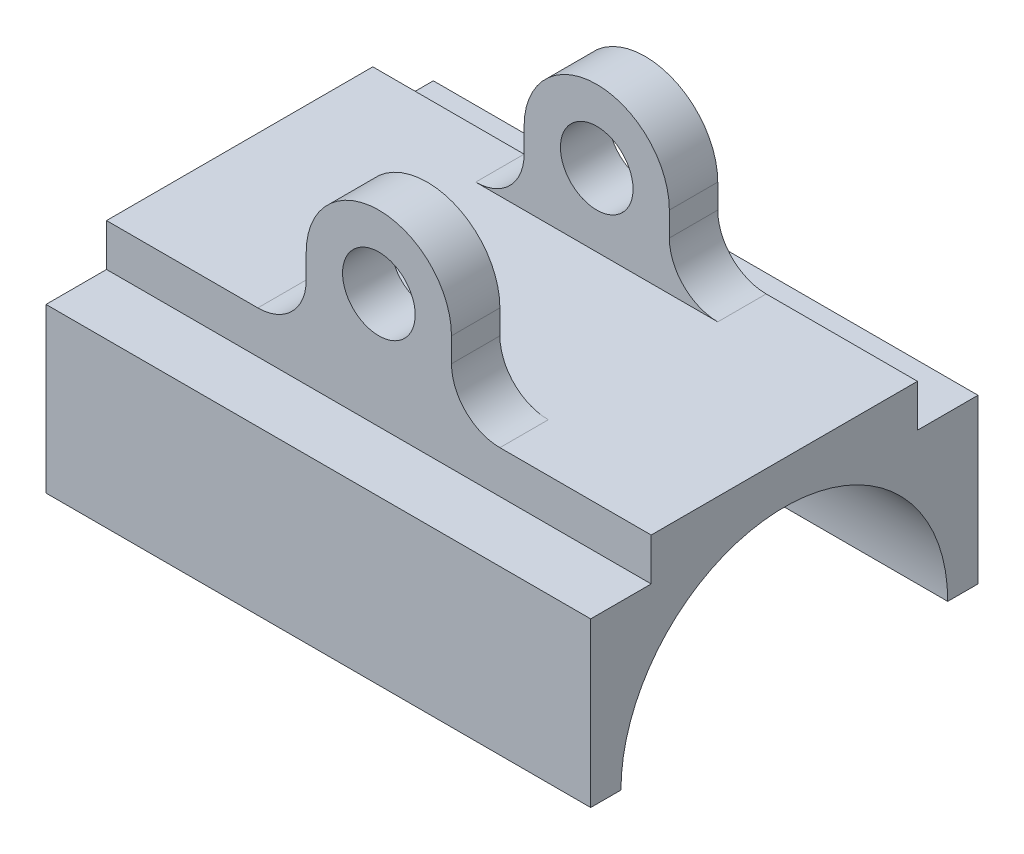
ISO-10303-21;
HEADER;
FILE_DESCRIPTION(('STEP AP214'),'2;1');
FILE_NAME('part.step','',(''),(''),'','','');
FILE_SCHEMA(('AUTOMOTIVE_DESIGN { 1 0 10303 214 1 1 1 1 }'));
ENDSEC;
DATA;
#1=APPLICATION_CONTEXT('core data for automotive mechanical design processes');
#2=APPLICATION_PROTOCOL_DEFINITION('international standard','automotive_design',2000,#1);
#3=PRODUCT_CONTEXT('',#1,'mechanical');
#4=PRODUCT('Part','Part','',(#3));
#5=PRODUCT_RELATED_PRODUCT_CATEGORY('part','',(#4));
#6=PRODUCT_DEFINITION_FORMATION('','',#4);
#7=PRODUCT_DEFINITION_CONTEXT('part definition',#1,'design');
#8=PRODUCT_DEFINITION('design','',#6,#7);
#9=PRODUCT_DEFINITION_SHAPE('','',#8);
#10=(LENGTH_UNIT() NAMED_UNIT(*) SI_UNIT(.MILLI.,.METRE.));
#11=(NAMED_UNIT(*) PLANE_ANGLE_UNIT() SI_UNIT($,.RADIAN.));
#12=(NAMED_UNIT(*) SI_UNIT($,.STERADIAN.) SOLID_ANGLE_UNIT());
#13=UNCERTAINTY_MEASURE_WITH_UNIT(LENGTH_MEASURE(1.E-05),#10,'distance_accuracy_value','');
#14=(GEOMETRIC_REPRESENTATION_CONTEXT(3) GLOBAL_UNCERTAINTY_ASSIGNED_CONTEXT((#13)) GLOBAL_UNIT_ASSIGNED_CONTEXT((#10,
#11,#12)) REPRESENTATION_CONTEXT('',''));
#15=CARTESIAN_POINT('',(0.,0.,0.));
#16=DIRECTION('',(0.,0.,1.));
#17=DIRECTION('',(1.,0.,0.));
#18=AXIS2_PLACEMENT_3D('',#15,#16,#17);
#19=CARTESIAN_POINT('',(-285.75,107.95,69.85));
#20=DIRECTION('',(0.,1.,0.));
#21=DIRECTION('',(0.,0.,1.));
#22=AXIS2_PLACEMENT_3D('',#19,#20,#21);
#23=PLANE('',#22);
#24=DIRECTION('',(1.,0.,0.));
#25=VECTOR('',#24,1.);
#26=CARTESIAN_POINT('',(-285.75,107.95,-69.85));
#27=LINE('',#26,#25);
#28=CARTESIAN_POINT('',(-79.375,107.95,-69.85));
#29=VERTEX_POINT('',#28);
#30=CARTESIAN_POINT('',(0.,107.95,-69.85));
#31=VERTEX_POINT('',#30);
#32=EDGE_CURVE('E318',#29,#31,#27,.T.);
#33=ORIENTED_EDGE('',*,*,#32,.F.);
#34=DIRECTION('',(0.,0.,-1.));
#35=VECTOR('',#34,1.);
#36=CARTESIAN_POINT('',(-79.375,107.95,69.85));
#37=LINE('',#36,#35);
#38=CARTESIAN_POINT('',(-79.375,107.95,-44.45));
#39=VERTEX_POINT('',#38);
#40=EDGE_CURVE('E351',#29,#39,#37,.F.);
#41=ORIENTED_EDGE('',*,*,#40,.T.);
#42=DIRECTION('',(1.,0.,0.));
#43=VECTOR('',#42,1.);
#44=CARTESIAN_POINT('',(-104.775,107.95,-44.45));
#45=LINE('',#44,#43);
#46=CARTESIAN_POINT('',(-206.375,107.95,-44.45));
#47=VERTEX_POINT('',#46);
#48=EDGE_CURVE('E201',#47,#39,#45,.T.);
#49=ORIENTED_EDGE('',*,*,#48,.F.);
#50=DIRECTION('',(0.,0.,-1.));
#51=VECTOR('',#50,1.);
#52=CARTESIAN_POINT('',(-206.375,107.95,69.85));
#53=LINE('',#52,#51);
#54=CARTESIAN_POINT('',(-206.375,107.95,-69.85));
#55=VERTEX_POINT('',#54);
#56=EDGE_CURVE('E348',#47,#55,#53,.T.);
#57=ORIENTED_EDGE('',*,*,#56,.T.);
#58=CARTESIAN_POINT('',(-285.75,107.95,-69.85));
#59=VERTEX_POINT('',#58);
#60=EDGE_CURVE('E316',#59,#55,#27,.T.);
#61=ORIENTED_EDGE('',*,*,#60,.F.);
#62=DIRECTION('',(0.,0.,1.));
#63=VECTOR('',#62,1.);
#64=CARTESIAN_POINT('',(-285.75,107.95,69.85));
#65=LINE('',#64,#63);
#66=CARTESIAN_POINT('',(-285.75,107.95,69.85));
#67=VERTEX_POINT('',#66);
#68=EDGE_CURVE('E259',#59,#67,#65,.T.);
#69=ORIENTED_EDGE('',*,*,#68,.T.);
#70=DIRECTION('',(1.,0.,0.));
#71=VECTOR('',#70,1.);
#72=CARTESIAN_POINT('',(-285.75,107.95,69.85));
#73=LINE('',#72,#71);
#74=CARTESIAN_POINT('',(-206.375,107.95,69.85));
#75=VERTEX_POINT('',#74);
#76=EDGE_CURVE('E312',#67,#75,#73,.T.);
#77=ORIENTED_EDGE('',*,*,#76,.T.);
#78=DIRECTION('',(0.,0.,1.));
#79=VECTOR('',#78,1.);
#80=CARTESIAN_POINT('',(-206.375,107.95,44.45));
#81=LINE('',#80,#79);
#82=CARTESIAN_POINT('',(-206.375,107.95,44.45));
#83=VERTEX_POINT('',#82);
#84=EDGE_CURVE('E305',#75,#83,#81,.F.);
#85=ORIENTED_EDGE('',*,*,#84,.T.);
#86=DIRECTION('',(1.,0.,0.));
#87=VECTOR('',#86,1.);
#88=CARTESIAN_POINT('',(-104.775,107.95,44.45));
#89=LINE('',#88,#87);
#90=CARTESIAN_POINT('',(-79.375,107.95,44.45));
#91=VERTEX_POINT('',#90);
#92=EDGE_CURVE('E220',#83,#91,#89,.T.);
#93=ORIENTED_EDGE('',*,*,#92,.T.);
#94=DIRECTION('',(0.,0.,1.));
#95=VECTOR('',#94,1.);
#96=CARTESIAN_POINT('',(-79.375,107.95,69.85));
#97=LINE('',#96,#95);
#98=CARTESIAN_POINT('',(-79.375,107.95,69.85));
#99=VERTEX_POINT('',#98);
#100=EDGE_CURVE('E328',#91,#99,#97,.T.);
#101=ORIENTED_EDGE('',*,*,#100,.T.);
#102=CARTESIAN_POINT('',(0.,107.95,69.85));
#103=VERTEX_POINT('',#102);
#104=EDGE_CURVE('E315',#99,#103,#73,.T.);
#105=ORIENTED_EDGE('',*,*,#104,.T.);
#106=DIRECTION('',(0.,0.,1.));
#107=VECTOR('',#106,1.);
#108=CARTESIAN_POINT('',(0.,107.95,69.85));
#109=LINE('',#108,#107);
#110=EDGE_CURVE('E289',#31,#103,#109,.T.);
#111=ORIENTED_EDGE('',*,*,#110,.F.);
#112=EDGE_LOOP('',(#33,#41,#49,#57,#61,#69,#77,#85,#93,#101,#105,#111));
#113=FACE_BOUND('',#112,.T.);
#114=ADVANCED_FACE('F32',(#113),#23,.T.);
#115=CARTESIAN_POINT('',(-285.75,0.,0.));
#116=DIRECTION('',(1.,0.,0.));
#117=DIRECTION('',(0.,0.,-1.));
#118=AXIS2_PLACEMENT_3D('',#115,#116,#117);
#119=CYLINDRICAL_SURFACE('',#118,85.725);
#120=CARTESIAN_POINT('',(0.,0.,0.));
#121=DIRECTION('',(-1.,0.,0.));
#122=DIRECTION('',(0.,0.,1.));
#123=AXIS2_PLACEMENT_3D('',#120,#121,#122);
#124=CIRCLE('',#123,85.725);
#125=CARTESIAN_POINT('',(0.,0.,85.725));
#126=VERTEX_POINT('',#125);
#127=CARTESIAN_POINT('',(0.,0.,-85.725));
#128=VERTEX_POINT('',#127);
#129=EDGE_CURVE('E240',#126,#128,#124,.T.);
#130=ORIENTED_EDGE('',*,*,#129,.F.);
#131=DIRECTION('',(1.,0.,0.));
#132=VECTOR('',#131,1.);
#133=CARTESIAN_POINT('',(-285.75,0.,85.725));
#134=LINE('',#133,#132);
#135=CARTESIAN_POINT('',(-285.75,0.,85.725));
#136=VERTEX_POINT('',#135);
#137=EDGE_CURVE('E303',#136,#126,#134,.T.);
#138=ORIENTED_EDGE('',*,*,#137,.F.);
#139=CARTESIAN_POINT('',(-285.75,0.,0.));
#140=DIRECTION('',(-1.,0.,0.));
#141=DIRECTION('',(0.,0.,1.));
#142=AXIS2_PLACEMENT_3D('',#139,#140,#141);
#143=CIRCLE('',#142,85.725);
#144=CARTESIAN_POINT('',(-285.75,0.,-85.725));
#145=VERTEX_POINT('',#144);
#146=EDGE_CURVE('E243',#136,#145,#143,.T.);
#147=ORIENTED_EDGE('',*,*,#146,.T.);
#148=DIRECTION('',(1.,0.,0.));
#149=VECTOR('',#148,1.);
#150=CARTESIAN_POINT('',(-285.75,0.,-85.725));
#151=LINE('',#150,#149);
#152=EDGE_CURVE('E274',#145,#128,#151,.T.);
#153=ORIENTED_EDGE('',*,*,#152,.T.);
#154=EDGE_LOOP('',(#130,#138,#147,#153));
#155=FACE_BOUND('',#154,.T.);
#156=ADVANCED_FACE('F396',(#155),#119,.F.);
#157=CARTESIAN_POINT('',(-285.75,0.,85.725));
#158=DIRECTION('',(0.,-1.,0.));
#159=DIRECTION('',(0.,0.,-1.));
#160=AXIS2_PLACEMENT_3D('',#157,#158,#159);
#161=PLANE('',#160);
#162=DIRECTION('',(0.,0.,-1.));
#163=VECTOR('',#162,1.);
#164=CARTESIAN_POINT('',(0.,0.,85.725));
#165=LINE('',#164,#163);
#166=CARTESIAN_POINT('',(0.,0.,101.6));
#167=VERTEX_POINT('',#166);
#168=EDGE_CURVE('E247',#167,#126,#165,.T.);
#169=ORIENTED_EDGE('',*,*,#168,.F.);
#170=DIRECTION('',(1.,0.,0.));
#171=VECTOR('',#170,1.);
#172=CARTESIAN_POINT('',(-285.75,0.,101.6));
#173=LINE('',#172,#171);
#174=CARTESIAN_POINT('',(-285.75,0.,101.6));
#175=VERTEX_POINT('',#174);
#176=EDGE_CURVE('E306',#175,#167,#173,.T.);
#177=ORIENTED_EDGE('',*,*,#176,.F.);
#178=DIRECTION('',(0.,0.,-1.));
#179=VECTOR('',#178,1.);
#180=CARTESIAN_POINT('',(-285.75,0.,85.725));
#181=LINE('',#180,#179);
#182=EDGE_CURVE('E271',#175,#136,#181,.T.);
#183=ORIENTED_EDGE('',*,*,#182,.T.);
#184=ORIENTED_EDGE('',*,*,#137,.T.);
#185=EDGE_LOOP('',(#169,#177,#183,#184));
#186=FACE_BOUND('',#185,.T.);
#187=ADVANCED_FACE('F401',(#186),#161,.T.);
#188=CARTESIAN_POINT('',(-285.75,0.,101.6));
#189=DIRECTION('',(0.,0.,1.));
#190=DIRECTION('',(0.,-1.,0.));
#191=AXIS2_PLACEMENT_3D('',#188,#189,#190);
#192=PLANE('',#191);
#193=DIRECTION('',(0.,-1.,0.));
#194=VECTOR('',#193,1.);
#195=CARTESIAN_POINT('',(0.,0.,101.6));
#196=LINE('',#195,#194);
#197=CARTESIAN_POINT('',(0.,85.725,101.6));
#198=VERTEX_POINT('',#197);
#199=EDGE_CURVE('E298',#198,#167,#196,.T.);
#200=ORIENTED_EDGE('',*,*,#199,.F.);
#201=DIRECTION('',(1.,0.,0.));
#202=VECTOR('',#201,1.);
#203=CARTESIAN_POINT('',(-285.75,85.725,101.6));
#204=LINE('',#203,#202);
#205=CARTESIAN_POINT('',(-285.75,85.725,101.6));
#206=VERTEX_POINT('',#205);
#207=EDGE_CURVE('E308',#206,#198,#204,.T.);
#208=ORIENTED_EDGE('',*,*,#207,.F.);
#209=DIRECTION('',(0.,-1.,0.));
#210=VECTOR('',#209,1.);
#211=CARTESIAN_POINT('',(-285.75,0.,101.6));
#212=LINE('',#211,#210);
#213=EDGE_CURVE('E268',#206,#175,#212,.T.);
#214=ORIENTED_EDGE('',*,*,#213,.T.);
#215=ORIENTED_EDGE('',*,*,#176,.T.);
#216=EDGE_LOOP('',(#200,#208,#214,#215));
#217=FACE_BOUND('',#216,.T.);
#218=ADVANCED_FACE('F404',(#217),#192,.T.);
#219=CARTESIAN_POINT('',(-285.75,85.725,101.6));
#220=DIRECTION('',(0.,1.,0.));
#221=DIRECTION('',(0.,0.,1.));
#222=AXIS2_PLACEMENT_3D('',#219,#220,#221);
#223=PLANE('',#222);
#224=DIRECTION('',(0.,0.,1.));
#225=VECTOR('',#224,1.);
#226=CARTESIAN_POINT('',(0.,85.725,101.6));
#227=LINE('',#226,#225);
#228=CARTESIAN_POINT('',(0.,85.725,69.85));
#229=VERTEX_POINT('',#228);
#230=EDGE_CURVE('E295',#229,#198,#227,.T.);
#231=ORIENTED_EDGE('',*,*,#230,.F.);
#232=DIRECTION('',(1.,0.,0.));
#233=VECTOR('',#232,1.);
#234=CARTESIAN_POINT('',(-285.75,85.725,69.85));
#235=LINE('',#234,#233);
#236=CARTESIAN_POINT('',(-285.75,85.725,69.85));
#237=VERTEX_POINT('',#236);
#238=EDGE_CURVE('E310',#237,#229,#235,.T.);
#239=ORIENTED_EDGE('',*,*,#238,.F.);
#240=DIRECTION('',(0.,0.,1.));
#241=VECTOR('',#240,1.);
#242=CARTESIAN_POINT('',(-285.75,85.725,101.6));
#243=LINE('',#242,#241);
#244=EDGE_CURVE('E265',#237,#206,#243,.T.);
#245=ORIENTED_EDGE('',*,*,#244,.T.);
#246=ORIENTED_EDGE('',*,*,#207,.T.);
#247=EDGE_LOOP('',(#231,#239,#245,#246));
#248=FACE_BOUND('',#247,.T.);
#249=ADVANCED_FACE('F408',(#248),#223,.T.);
#250=CARTESIAN_POINT('',(-285.75,85.725,69.85));
#251=DIRECTION('',(0.,0.,1.));
#252=DIRECTION('',(1.,0.,0.));
#253=AXIS2_PLACEMENT_3D('',#250,#251,#252);
#254=PLANE('',#253);
#255=CARTESIAN_POINT('',(-142.875,146.05,69.85));
#256=DIRECTION('',(0.,0.,1.));
#257=DIRECTION('',(1.,0.,0.));
#258=AXIS2_PLACEMENT_3D('',#255,#256,#257);
#259=CIRCLE('',#258,19.05);
#260=CARTESIAN_POINT('',(-123.825,146.05,69.85));
#261=VERTEX_POINT('',#260);
#262=EDGE_CURVE('E212',#261,#261,#259,.T.);
#263=ORIENTED_EDGE('',*,*,#262,.F.);
#264=EDGE_LOOP('',(#263));
#265=FACE_BOUND('',#264,.T.);
#266=DIRECTION('',(0.,-1.,0.));
#267=VECTOR('',#266,1.);
#268=CARTESIAN_POINT('',(0.,85.725,69.85));
#269=LINE('',#268,#267);
#270=EDGE_CURVE('E292',#103,#229,#269,.T.);
#271=ORIENTED_EDGE('',*,*,#270,.F.);
#272=ORIENTED_EDGE('',*,*,#104,.F.);
#273=CARTESIAN_POINT('',(-79.375,133.35,69.85));
#274=DIRECTION('',(0.,0.,1.));
#275=DIRECTION('',(1.,0.,0.));
#276=AXIS2_PLACEMENT_3D('',#273,#274,#275);
#277=CIRCLE('',#276,25.4);
#278=CARTESIAN_POINT('',(-104.775,133.35,69.85));
#279=VERTEX_POINT('',#278);
#280=EDGE_CURVE('E336',#99,#279,#277,.F.);
#281=ORIENTED_EDGE('',*,*,#280,.T.);
#282=DIRECTION('',(0.,1.,0.));
#283=VECTOR('',#282,1.);
#284=CARTESIAN_POINT('',(-104.775,146.05,69.85));
#285=LINE('',#284,#283);
#286=CARTESIAN_POINT('',(-104.775,146.05,69.85));
#287=VERTEX_POINT('',#286);
#288=EDGE_CURVE('E219',#279,#287,#285,.T.);
#289=ORIENTED_EDGE('',*,*,#288,.T.);
#290=CARTESIAN_POINT('',(-142.875,146.05,69.85));
#291=DIRECTION('',(0.,0.,1.));
#292=DIRECTION('',(-1.,0.,0.));
#293=AXIS2_PLACEMENT_3D('',#290,#291,#292);
#294=CIRCLE('',#293,38.1);
#295=CARTESIAN_POINT('',(-180.975,146.05,69.85));
#296=VERTEX_POINT('',#295);
#297=EDGE_CURVE('E233',#287,#296,#294,.T.);
#298=ORIENTED_EDGE('',*,*,#297,.T.);
#299=DIRECTION('',(0.,-1.,0.));
#300=VECTOR('',#299,1.);
#301=CARTESIAN_POINT('',(-180.975,107.95,69.85));
#302=LINE('',#301,#300);
#303=CARTESIAN_POINT('',(-180.975,133.35,69.85));
#304=VERTEX_POINT('',#303);
#305=EDGE_CURVE('E223',#296,#304,#302,.T.);
#306=ORIENTED_EDGE('',*,*,#305,.T.);
#307=CARTESIAN_POINT('',(-206.375,133.35,69.85));
#308=DIRECTION('',(0.,0.,1.));
#309=DIRECTION('',(1.,0.,0.));
#310=AXIS2_PLACEMENT_3D('',#307,#308,#309);
#311=CIRCLE('',#310,25.4);
#312=EDGE_CURVE('E341',#304,#75,#311,.F.);
#313=ORIENTED_EDGE('',*,*,#312,.T.);
#314=ORIENTED_EDGE('',*,*,#76,.F.);
#315=DIRECTION('',(0.,-1.,0.));
#316=VECTOR('',#315,1.);
#317=CARTESIAN_POINT('',(-285.75,85.725,69.85));
#318=LINE('',#317,#316);
#319=EDGE_CURVE('E262',#67,#237,#318,.T.);
#320=ORIENTED_EDGE('',*,*,#319,.T.);
#321=ORIENTED_EDGE('',*,*,#238,.T.);
#322=EDGE_LOOP('',(#271,#272,#281,#289,#298,#306,#313,#314,#320,#321));
#323=FACE_BOUND('',#322,.T.);
#324=ADVANCED_FACE('F410',(#265,#323),#254,.T.);
#325=CARTESIAN_POINT('',(-285.75,107.95,-69.85));
#326=DIRECTION('',(0.,0.,-1.));
#327=DIRECTION('',(-1.,0.,0.));
#328=AXIS2_PLACEMENT_3D('',#325,#326,#327);
#329=PLANE('',#328);
#330=CARTESIAN_POINT('',(-142.875,146.05,-69.85));
#331=DIRECTION('',(0.,0.,1.));
#332=DIRECTION('',(1.,0.,0.));
#333=AXIS2_PLACEMENT_3D('',#330,#331,#332);
#334=CIRCLE('',#333,19.05);
#335=CARTESIAN_POINT('',(-123.825,146.05,-69.85));
#336=VERTEX_POINT('',#335);
#337=EDGE_CURVE('E625',#336,#336,#334,.T.);
#338=ORIENTED_EDGE('',*,*,#337,.T.);
#339=EDGE_LOOP('',(#338));
#340=FACE_BOUND('',#339,.T.);
#341=DIRECTION('',(0.,1.,0.));
#342=VECTOR('',#341,1.);
#343=CARTESIAN_POINT('',(0.,107.95,-69.85));
#344=LINE('',#343,#342);
#345=CARTESIAN_POINT('',(0.,85.725,-69.85));
#346=VERTEX_POINT('',#345);
#347=EDGE_CURVE('E286',#346,#31,#344,.T.);
#348=ORIENTED_EDGE('',*,*,#347,.F.);
#349=DIRECTION('',(1.,0.,0.));
#350=VECTOR('',#349,1.);
#351=CARTESIAN_POINT('',(-285.75,85.725,-69.85));
#352=LINE('',#351,#350);
#353=CARTESIAN_POINT('',(-285.75,85.725,-69.85));
#354=VERTEX_POINT('',#353);
#355=EDGE_CURVE('E319',#354,#346,#352,.T.);
#356=ORIENTED_EDGE('',*,*,#355,.F.);
#357=DIRECTION('',(0.,1.,0.));
#358=VECTOR('',#357,1.);
#359=CARTESIAN_POINT('',(-285.75,107.95,-69.85));
#360=LINE('',#359,#358);
#361=EDGE_CURVE('E256',#354,#59,#360,.T.);
#362=ORIENTED_EDGE('',*,*,#361,.T.);
#363=ORIENTED_EDGE('',*,*,#60,.T.);
#364=CARTESIAN_POINT('',(-206.375,133.35,-69.85));
#365=DIRECTION('',(0.,0.,-1.));
#366=DIRECTION('',(-1.,0.,0.));
#367=AXIS2_PLACEMENT_3D('',#364,#365,#366);
#368=CIRCLE('',#367,25.4);
#369=CARTESIAN_POINT('',(-180.975,133.35,-69.85));
#370=VERTEX_POINT('',#369);
#371=EDGE_CURVE('E41',#55,#370,#368,.F.);
#372=ORIENTED_EDGE('',*,*,#371,.T.);
#373=DIRECTION('',(0.,-1.,0.));
#374=VECTOR('',#373,1.);
#375=CARTESIAN_POINT('',(-180.975,107.95,-69.85));
#376=LINE('',#375,#374);
#377=CARTESIAN_POINT('',(-180.975,146.05,-69.85));
#378=VERTEX_POINT('',#377);
#379=EDGE_CURVE('E208',#378,#370,#376,.T.);
#380=ORIENTED_EDGE('',*,*,#379,.F.);
#381=CARTESIAN_POINT('',(-142.875,146.05,-69.85));
#382=DIRECTION('',(0.,0.,1.));
#383=DIRECTION('',(-1.,0.,0.));
#384=AXIS2_PLACEMENT_3D('',#381,#382,#383);
#385=CIRCLE('',#384,38.1);
#386=CARTESIAN_POINT('',(-104.775,146.05,-69.85));
#387=VERTEX_POINT('',#386);
#388=EDGE_CURVE('E197',#387,#378,#385,.T.);
#389=ORIENTED_EDGE('',*,*,#388,.F.);
#390=DIRECTION('',(0.,1.,0.));
#391=VECTOR('',#390,1.);
#392=CARTESIAN_POINT('',(-104.775,146.05,-69.85));
#393=LINE('',#392,#391);
#394=CARTESIAN_POINT('',(-104.775,133.35,-69.85));
#395=VERTEX_POINT('',#394);
#396=EDGE_CURVE('E203',#395,#387,#393,.T.);
#397=ORIENTED_EDGE('',*,*,#396,.F.);
#398=CARTESIAN_POINT('',(-79.375,133.35,-69.85));
#399=DIRECTION('',(0.,0.,-1.));
#400=DIRECTION('',(-1.,0.,0.));
#401=AXIS2_PLACEMENT_3D('',#398,#399,#400);
#402=CIRCLE('',#401,25.4);
#403=EDGE_CURVE('E355',#395,#29,#402,.F.);
#404=ORIENTED_EDGE('',*,*,#403,.T.);
#405=ORIENTED_EDGE('',*,*,#32,.T.);
#406=EDGE_LOOP('',(#348,#356,#362,#363,#372,#380,#389,#397,#404,#405));
#407=FACE_BOUND('',#406,.T.);
#408=ADVANCED_FACE('F369',(#340,#407),#329,.T.);
#409=CARTESIAN_POINT('',(-285.75,85.725,-69.85));
#410=DIRECTION('',(0.,1.,0.));
#411=DIRECTION('',(0.,0.,1.));
#412=AXIS2_PLACEMENT_3D('',#409,#410,#411);
#413=PLANE('',#412);
#414=DIRECTION('',(0.,0.,1.));
#415=VECTOR('',#414,1.);
#416=CARTESIAN_POINT('',(0.,85.725,-69.85));
#417=LINE('',#416,#415);
#418=CARTESIAN_POINT('',(0.,85.725,-101.6));
#419=VERTEX_POINT('',#418);
#420=EDGE_CURVE('E283',#419,#346,#417,.T.);
#421=ORIENTED_EDGE('',*,*,#420,.F.);
#422=DIRECTION('',(1.,0.,0.));
#423=VECTOR('',#422,1.);
#424=CARTESIAN_POINT('',(-285.75,85.725,-101.6));
#425=LINE('',#424,#423);
#426=CARTESIAN_POINT('',(-285.75,85.725,-101.6));
#427=VERTEX_POINT('',#426);
#428=EDGE_CURVE('E321',#427,#419,#425,.T.);
#429=ORIENTED_EDGE('',*,*,#428,.F.);
#430=DIRECTION('',(0.,0.,1.));
#431=VECTOR('',#430,1.);
#432=CARTESIAN_POINT('',(-285.75,85.725,-69.85));
#433=LINE('',#432,#431);
#434=EDGE_CURVE('E253',#427,#354,#433,.T.);
#435=ORIENTED_EDGE('',*,*,#434,.T.);
#436=ORIENTED_EDGE('',*,*,#355,.T.);
#437=EDGE_LOOP('',(#421,#429,#435,#436));
#438=FACE_BOUND('',#437,.T.);
#439=ADVANCED_FACE('F386',(#438),#413,.T.);
#440=CARTESIAN_POINT('',(-285.75,85.725,-101.6));
#441=DIRECTION('',(0.,0.,-1.));
#442=DIRECTION('',(0.,1.,0.));
#443=AXIS2_PLACEMENT_3D('',#440,#441,#442);
#444=PLANE('',#443);
#445=DIRECTION('',(0.,1.,0.));
#446=VECTOR('',#445,1.);
#447=CARTESIAN_POINT('',(0.,85.725,-101.6));
#448=LINE('',#447,#446);
#449=CARTESIAN_POINT('',(0.,0.,-101.6));
#450=VERTEX_POINT('',#449);
#451=EDGE_CURVE('E280',#450,#419,#448,.T.);
#452=ORIENTED_EDGE('',*,*,#451,.F.);
#453=DIRECTION('',(1.,0.,0.));
#454=VECTOR('',#453,1.);
#455=CARTESIAN_POINT('',(-285.75,0.,-101.6));
#456=LINE('',#455,#454);
#457=CARTESIAN_POINT('',(-285.75,0.,-101.6));
#458=VERTEX_POINT('',#457);
#459=EDGE_CURVE('E323',#458,#450,#456,.T.);
#460=ORIENTED_EDGE('',*,*,#459,.F.);
#461=DIRECTION('',(0.,1.,0.));
#462=VECTOR('',#461,1.);
#463=CARTESIAN_POINT('',(-285.75,85.725,-101.6));
#464=LINE('',#463,#462);
#465=EDGE_CURVE('E250',#458,#427,#464,.T.);
#466=ORIENTED_EDGE('',*,*,#465,.T.);
#467=ORIENTED_EDGE('',*,*,#428,.T.);
#468=EDGE_LOOP('',(#452,#460,#466,#467));
#469=FACE_BOUND('',#468,.T.);
#470=ADVANCED_FACE('F389',(#469),#444,.T.);
#471=CARTESIAN_POINT('',(-285.75,0.,-101.6));
#472=DIRECTION('',(0.,-1.,0.));
#473=DIRECTION('',(0.,0.,-1.));
#474=AXIS2_PLACEMENT_3D('',#471,#472,#473);
#475=PLANE('',#474);
#476=DIRECTION('',(0.,0.,-1.));
#477=VECTOR('',#476,1.);
#478=CARTESIAN_POINT('',(0.,0.,-101.6));
#479=LINE('',#478,#477);
#480=EDGE_CURVE('E277',#128,#450,#479,.T.);
#481=ORIENTED_EDGE('',*,*,#480,.F.);
#482=ORIENTED_EDGE('',*,*,#152,.F.);
#483=DIRECTION('',(0.,0.,-1.));
#484=VECTOR('',#483,1.);
#485=CARTESIAN_POINT('',(-285.75,0.,-101.6));
#486=LINE('',#485,#484);
#487=EDGE_CURVE('E246',#145,#458,#486,.T.);
#488=ORIENTED_EDGE('',*,*,#487,.T.);
#489=ORIENTED_EDGE('',*,*,#459,.T.);
#490=EDGE_LOOP('',(#481,#482,#488,#489));
#491=FACE_BOUND('',#490,.T.);
#492=ADVANCED_FACE('F393',(#491),#475,.T.);
#493=CARTESIAN_POINT('',(-285.75,0.,0.));
#494=DIRECTION('',(-1.,0.,0.));
#495=DIRECTION('',(0.,0.,1.));
#496=AXIS2_PLACEMENT_3D('',#493,#494,#495);
#497=PLANE('',#496);
#498=ORIENTED_EDGE('',*,*,#146,.F.);
#499=ORIENTED_EDGE('',*,*,#182,.F.);
#500=ORIENTED_EDGE('',*,*,#213,.F.);
#501=ORIENTED_EDGE('',*,*,#244,.F.);
#502=ORIENTED_EDGE('',*,*,#319,.F.);
#503=ORIENTED_EDGE('',*,*,#68,.F.);
#504=ORIENTED_EDGE('',*,*,#361,.F.);
#505=ORIENTED_EDGE('',*,*,#434,.F.);
#506=ORIENTED_EDGE('',*,*,#465,.F.);
#507=ORIENTED_EDGE('',*,*,#487,.F.);
#508=EDGE_LOOP('',(#498,#499,#500,#501,#502,#503,#504,#505,#506,#507));
#509=FACE_BOUND('',#508,.T.);
#510=ADVANCED_FACE('F383',(#509),#497,.T.);
#511=CARTESIAN_POINT('',(0.,0.,0.));
#512=DIRECTION('',(-1.,0.,0.));
#513=DIRECTION('',(0.,0.,1.));
#514=AXIS2_PLACEMENT_3D('',#511,#512,#513);
#515=PLANE('',#514);
#516=ORIENTED_EDGE('',*,*,#129,.T.);
#517=ORIENTED_EDGE('',*,*,#480,.T.);
#518=ORIENTED_EDGE('',*,*,#451,.T.);
#519=ORIENTED_EDGE('',*,*,#420,.T.);
#520=ORIENTED_EDGE('',*,*,#347,.T.);
#521=ORIENTED_EDGE('',*,*,#110,.T.);
#522=ORIENTED_EDGE('',*,*,#270,.T.);
#523=ORIENTED_EDGE('',*,*,#230,.T.);
#524=ORIENTED_EDGE('',*,*,#199,.T.);
#525=ORIENTED_EDGE('',*,*,#168,.T.);
#526=EDGE_LOOP('',(#516,#517,#518,#519,#520,#521,#522,#523,#524,#525));
#527=FACE_BOUND('',#526,.T.);
#528=ADVANCED_FACE('F375',(#527),#515,.F.);
#529=CARTESIAN_POINT('',(-180.975,107.95,44.45));
#530=DIRECTION('',(-1.,0.,0.));
#531=DIRECTION('',(0.,0.,1.));
#532=AXIS2_PLACEMENT_3D('',#529,#530,#531);
#533=PLANE('',#532);
#534=DIRECTION('',(0.,-1.,0.));
#535=VECTOR('',#534,1.);
#536=CARTESIAN_POINT('',(-180.975,107.95,44.45));
#537=LINE('',#536,#535);
#538=CARTESIAN_POINT('',(-180.975,146.05,44.45));
#539=VERTEX_POINT('',#538);
#540=CARTESIAN_POINT('',(-180.975,133.35,44.45));
#541=VERTEX_POINT('',#540);
#542=EDGE_CURVE('E228',#539,#541,#537,.T.);
#543=ORIENTED_EDGE('',*,*,#542,.T.);
#544=DIRECTION('',(0.,0.,1.));
#545=VECTOR('',#544,1.);
#546=CARTESIAN_POINT('',(-180.975,133.35,69.85));
#547=LINE('',#546,#545);
#548=EDGE_CURVE('E333',#541,#304,#547,.T.);
#549=ORIENTED_EDGE('',*,*,#548,.T.);
#550=ORIENTED_EDGE('',*,*,#305,.F.);
#551=DIRECTION('',(0.,0.,1.));
#552=VECTOR('',#551,1.);
#553=CARTESIAN_POINT('',(-180.975,146.05,44.45));
#554=LINE('',#553,#552);
#555=EDGE_CURVE('E238',#539,#296,#554,.T.);
#556=ORIENTED_EDGE('',*,*,#555,.F.);
#557=EDGE_LOOP('',(#543,#549,#550,#556));
#558=FACE_BOUND('',#557,.T.);
#559=ADVANCED_FACE('F460',(#558),#533,.T.);
#560=CARTESIAN_POINT('',(-142.875,146.05,44.45));
#561=DIRECTION('',(0.,0.,1.));
#562=DIRECTION('',(1.,0.,0.));
#563=AXIS2_PLACEMENT_3D('',#560,#561,#562);
#564=CYLINDRICAL_SURFACE('',#563,38.1);
#565=ORIENTED_EDGE('',*,*,#297,.F.);
#566=DIRECTION('',(0.,0.,1.));
#567=VECTOR('',#566,1.);
#568=CARTESIAN_POINT('',(-104.775,146.05,44.45));
#569=LINE('',#568,#567);
#570=CARTESIAN_POINT('',(-104.775,146.05,44.45));
#571=VERTEX_POINT('',#570);
#572=EDGE_CURVE('E231',#571,#287,#569,.T.);
#573=ORIENTED_EDGE('',*,*,#572,.F.);
#574=CARTESIAN_POINT('',(-142.875,146.05,44.45));
#575=DIRECTION('',(0.,0.,1.));
#576=DIRECTION('',(-1.,0.,0.));
#577=AXIS2_PLACEMENT_3D('',#574,#575,#576);
#578=CIRCLE('',#577,38.1);
#579=EDGE_CURVE('E225',#571,#539,#578,.T.);
#580=ORIENTED_EDGE('',*,*,#579,.T.);
#581=ORIENTED_EDGE('',*,*,#555,.T.);
#582=EDGE_LOOP('',(#565,#573,#580,#581));
#583=FACE_BOUND('',#582,.T.);
#584=ADVANCED_FACE('F465',(#583),#564,.T.);
#585=CARTESIAN_POINT('',(-104.775,146.05,44.45));
#586=DIRECTION('',(1.,0.,0.));
#587=DIRECTION('',(0.,1.,0.));
#588=AXIS2_PLACEMENT_3D('',#585,#586,#587);
#589=PLANE('',#588);
#590=ORIENTED_EDGE('',*,*,#288,.F.);
#591=DIRECTION('',(0.,0.,1.));
#592=VECTOR('',#591,1.);
#593=CARTESIAN_POINT('',(-104.775,133.35,44.45));
#594=LINE('',#593,#592);
#595=CARTESIAN_POINT('',(-104.775,133.35,44.45));
#596=VERTEX_POINT('',#595);
#597=EDGE_CURVE('E331',#279,#596,#594,.F.);
#598=ORIENTED_EDGE('',*,*,#597,.T.);
#599=DIRECTION('',(0.,1.,0.));
#600=VECTOR('',#599,1.);
#601=CARTESIAN_POINT('',(-104.775,146.05,44.45));
#602=LINE('',#601,#600);
#603=EDGE_CURVE('E222',#596,#571,#602,.T.);
#604=ORIENTED_EDGE('',*,*,#603,.T.);
#605=ORIENTED_EDGE('',*,*,#572,.T.);
#606=EDGE_LOOP('',(#590,#598,#604,#605));
#607=FACE_BOUND('',#606,.T.);
#608=ADVANCED_FACE('F472',(#607),#589,.T.);
#609=CARTESIAN_POINT('',(-142.875,146.05,44.45));
#610=DIRECTION('',(0.,0.,-1.));
#611=DIRECTION('',(-1.,0.,0.));
#612=AXIS2_PLACEMENT_3D('',#609,#610,#611);
#613=PLANE('',#612);
#614=CARTESIAN_POINT('',(-142.875,146.05,44.45));
#615=DIRECTION('',(0.,0.,-1.));
#616=DIRECTION('',(-1.,0.,0.));
#617=AXIS2_PLACEMENT_3D('',#614,#615,#616);
#618=CIRCLE('',#617,19.05);
#619=CARTESIAN_POINT('',(-161.925,146.05,44.45));
#620=VERTEX_POINT('',#619);
#621=EDGE_CURVE('E216',#620,#620,#618,.F.);
#622=ORIENTED_EDGE('',*,*,#621,.T.);
#623=EDGE_LOOP('',(#622));
#624=FACE_BOUND('',#623,.T.);
#625=ORIENTED_EDGE('',*,*,#92,.F.);
#626=CARTESIAN_POINT('',(-206.375,133.35,44.45));
#627=DIRECTION('',(0.,0.,-1.));
#628=DIRECTION('',(-1.,0.,0.));
#629=AXIS2_PLACEMENT_3D('',#626,#627,#628);
#630=CIRCLE('',#629,25.4);
#631=EDGE_CURVE('E343',#83,#541,#630,.F.);
#632=ORIENTED_EDGE('',*,*,#631,.T.);
#633=ORIENTED_EDGE('',*,*,#542,.F.);
#634=ORIENTED_EDGE('',*,*,#579,.F.);
#635=ORIENTED_EDGE('',*,*,#603,.F.);
#636=CARTESIAN_POINT('',(-79.375,133.35,44.45));
#637=DIRECTION('',(0.,0.,-1.));
#638=DIRECTION('',(-1.,0.,0.));
#639=AXIS2_PLACEMENT_3D('',#636,#637,#638);
#640=CIRCLE('',#639,25.4);
#641=EDGE_CURVE('E338',#596,#91,#640,.F.);
#642=ORIENTED_EDGE('',*,*,#641,.T.);
#643=EDGE_LOOP('',(#625,#632,#633,#634,#635,#642));
#644=FACE_BOUND('',#643,.T.);
#645=ADVANCED_FACE('F444',(#624,#644),#613,.T.);
#646=CARTESIAN_POINT('',(-79.375,133.35,69.85));
#647=DIRECTION('',(0.,0.,-1.));
#648=DIRECTION('',(-1.,0.,0.));
#649=AXIS2_PLACEMENT_3D('',#646,#647,#648);
#650=CYLINDRICAL_SURFACE('',#649,25.4);
#651=ORIENTED_EDGE('',*,*,#641,.F.);
#652=ORIENTED_EDGE('',*,*,#597,.F.);
#653=ORIENTED_EDGE('',*,*,#280,.F.);
#654=ORIENTED_EDGE('',*,*,#100,.F.);
#655=EDGE_LOOP('',(#651,#652,#653,#654));
#656=FACE_BOUND('',#655,.T.);
#657=ADVANCED_FACE('F440',(#656),#650,.F.);
#658=CARTESIAN_POINT('',(-206.375,133.35,44.45));
#659=DIRECTION('',(0.,0.,-1.));
#660=DIRECTION('',(-1.,0.,0.));
#661=AXIS2_PLACEMENT_3D('',#658,#659,#660);
#662=CYLINDRICAL_SURFACE('',#661,25.4);
#663=ORIENTED_EDGE('',*,*,#631,.F.);
#664=ORIENTED_EDGE('',*,*,#84,.F.);
#665=ORIENTED_EDGE('',*,*,#312,.F.);
#666=ORIENTED_EDGE('',*,*,#548,.F.);
#667=EDGE_LOOP('',(#663,#664,#665,#666));
#668=FACE_BOUND('',#667,.T.);
#669=ADVANCED_FACE('F443',(#668),#662,.F.);
#670=CARTESIAN_POINT('',(-142.875,146.05,-9.43153672641496));
#671=DIRECTION('',(0.,0.,1.));
#672=DIRECTION('',(1.,0.,0.));
#673=AXIS2_PLACEMENT_3D('',#670,#671,#672);
#674=CYLINDRICAL_SURFACE('',#673,19.05);
#675=ORIENTED_EDGE('',*,*,#262,.T.);
#676=EDGE_LOOP('',(#675));
#677=FACE_BOUND('',#676,.T.);
#678=ORIENTED_EDGE('',*,*,#621,.F.);
#679=EDGE_LOOP('',(#678));
#680=FACE_BOUND('',#679,.T.);
#681=ADVANCED_FACE('F447',(#677,#680),#674,.F.);
#682=CARTESIAN_POINT('',(-104.775,146.05,-44.45));
#683=DIRECTION('',(-1.,0.,0.));
#684=DIRECTION('',(0.,-1.,0.));
#685=AXIS2_PLACEMENT_3D('',#682,#683,#684);
#686=PLANE('',#685);
#687=DIRECTION('',(0.,1.,0.));
#688=VECTOR('',#687,1.);
#689=CARTESIAN_POINT('',(-104.775,146.05,-44.45));
#690=LINE('',#689,#688);
#691=CARTESIAN_POINT('',(-104.775,133.35,-44.45));
#692=VERTEX_POINT('',#691);
#693=CARTESIAN_POINT('',(-104.775,146.05,-44.45));
#694=VERTEX_POINT('',#693);
#695=EDGE_CURVE('E188',#692,#694,#690,.T.);
#696=ORIENTED_EDGE('',*,*,#695,.F.);
#697=DIRECTION('',(0.,0.,-1.));
#698=VECTOR('',#697,1.);
#699=CARTESIAN_POINT('',(-104.775,133.35,-44.45));
#700=LINE('',#699,#698);
#701=EDGE_CURVE('E345',#692,#395,#700,.T.);
#702=ORIENTED_EDGE('',*,*,#701,.T.);
#703=ORIENTED_EDGE('',*,*,#396,.T.);
#704=DIRECTION('',(0.,0.,-1.));
#705=VECTOR('',#704,1.);
#706=CARTESIAN_POINT('',(-104.775,146.05,-44.45));
#707=LINE('',#706,#705);
#708=EDGE_CURVE('E198',#694,#387,#707,.T.);
#709=ORIENTED_EDGE('',*,*,#708,.F.);
#710=EDGE_LOOP('',(#696,#702,#703,#709));
#711=FACE_BOUND('',#710,.T.);
#712=ADVANCED_FACE('F364',(#711),#686,.F.);
#713=CARTESIAN_POINT('',(-142.875,146.05,-44.45));
#714=DIRECTION('',(0.,0.,-1.));
#715=DIRECTION('',(-1.,0.,0.));
#716=AXIS2_PLACEMENT_3D('',#713,#714,#715);
#717=CYLINDRICAL_SURFACE('',#716,38.1);
#718=ORIENTED_EDGE('',*,*,#388,.T.);
#719=DIRECTION('',(0.,0.,-1.));
#720=VECTOR('',#719,1.);
#721=CARTESIAN_POINT('',(-180.975,146.05,-44.45));
#722=LINE('',#721,#720);
#723=CARTESIAN_POINT('',(-180.975,146.05,-44.45));
#724=VERTEX_POINT('',#723);
#725=EDGE_CURVE('E194',#724,#378,#722,.T.);
#726=ORIENTED_EDGE('',*,*,#725,.F.);
#727=CARTESIAN_POINT('',(-142.875,146.05,-44.45));
#728=DIRECTION('',(0.,0.,1.));
#729=DIRECTION('',(-1.,0.,0.));
#730=AXIS2_PLACEMENT_3D('',#727,#728,#729);
#731=CIRCLE('',#730,38.1);
#732=EDGE_CURVE('E182',#694,#724,#731,.T.);
#733=ORIENTED_EDGE('',*,*,#732,.F.);
#734=ORIENTED_EDGE('',*,*,#708,.T.);
#735=EDGE_LOOP('',(#718,#726,#733,#734));
#736=FACE_BOUND('',#735,.T.);
#737=ADVANCED_FACE('F195',(#736),#717,.T.);
#738=CARTESIAN_POINT('',(-180.975,107.95,-44.45));
#739=DIRECTION('',(1.,0.,0.));
#740=DIRECTION('',(0.,0.,-1.));
#741=AXIS2_PLACEMENT_3D('',#738,#739,#740);
#742=PLANE('',#741);
#743=ORIENTED_EDGE('',*,*,#379,.T.);
#744=DIRECTION('',(0.,0.,-1.));
#745=VECTOR('',#744,1.);
#746=CARTESIAN_POINT('',(-180.975,133.35,-44.45));
#747=LINE('',#746,#745);
#748=CARTESIAN_POINT('',(-180.975,133.35,-44.45));
#749=VERTEX_POINT('',#748);
#750=EDGE_CURVE('E48',#370,#749,#747,.F.);
#751=ORIENTED_EDGE('',*,*,#750,.T.);
#752=DIRECTION('',(0.,-1.,0.));
#753=VECTOR('',#752,1.);
#754=CARTESIAN_POINT('',(-180.975,107.95,-44.45));
#755=LINE('',#754,#753);
#756=EDGE_CURVE('E185',#724,#749,#755,.T.);
#757=ORIENTED_EDGE('',*,*,#756,.F.);
#758=ORIENTED_EDGE('',*,*,#725,.T.);
#759=EDGE_LOOP('',(#743,#751,#757,#758));
#760=FACE_BOUND('',#759,.T.);
#761=ADVANCED_FACE('F200',(#760),#742,.F.);
#762=CARTESIAN_POINT('',(-142.875,146.05,-44.45));
#763=DIRECTION('',(0.,0.,1.));
#764=DIRECTION('',(-1.,0.,0.));
#765=AXIS2_PLACEMENT_3D('',#762,#763,#764);
#766=PLANE('',#765);
#767=CARTESIAN_POINT('',(-142.875,146.05,-44.45));
#768=DIRECTION('',(0.,0.,1.));
#769=DIRECTION('',(1.,0.,0.));
#770=AXIS2_PLACEMENT_3D('',#767,#768,#769);
#771=CIRCLE('',#770,19.05);
#772=CARTESIAN_POINT('',(-123.825,146.05,-44.45));
#773=VERTEX_POINT('',#772);
#774=EDGE_CURVE('E36',#773,#773,#771,.F.);
#775=ORIENTED_EDGE('',*,*,#774,.T.);
#776=EDGE_LOOP('',(#775));
#777=FACE_BOUND('',#776,.T.);
#778=ORIENTED_EDGE('',*,*,#48,.T.);
#779=CARTESIAN_POINT('',(-79.375,133.35,-44.45));
#780=DIRECTION('',(0.,0.,1.));
#781=DIRECTION('',(1.,0.,0.));
#782=AXIS2_PLACEMENT_3D('',#779,#780,#781);
#783=CIRCLE('',#782,25.4);
#784=EDGE_CURVE('E357',#39,#692,#783,.F.);
#785=ORIENTED_EDGE('',*,*,#784,.T.);
#786=ORIENTED_EDGE('',*,*,#695,.T.);
#787=ORIENTED_EDGE('',*,*,#732,.T.);
#788=ORIENTED_EDGE('',*,*,#756,.T.);
#789=CARTESIAN_POINT('',(-206.375,133.35,-44.45));
#790=DIRECTION('',(0.,0.,1.));
#791=DIRECTION('',(1.,0.,0.));
#792=AXIS2_PLACEMENT_3D('',#789,#790,#791);
#793=CIRCLE('',#792,25.4);
#794=EDGE_CURVE('E11',#749,#47,#793,.F.);
#795=ORIENTED_EDGE('',*,*,#794,.T.);
#796=EDGE_LOOP('',(#778,#785,#786,#787,#788,#795));
#797=FACE_BOUND('',#796,.T.);
#798=ADVANCED_FACE('F184',(#777,#797),#766,.T.);
#799=CARTESIAN_POINT('',(-79.375,133.35,-44.45));
#800=DIRECTION('',(0.,0.,-1.));
#801=DIRECTION('',(-1.,0.,0.));
#802=AXIS2_PLACEMENT_3D('',#799,#800,#801);
#803=CYLINDRICAL_SURFACE('',#802,25.4);
#804=ORIENTED_EDGE('',*,*,#784,.F.);
#805=ORIENTED_EDGE('',*,*,#40,.F.);
#806=ORIENTED_EDGE('',*,*,#403,.F.);
#807=ORIENTED_EDGE('',*,*,#701,.F.);
#808=EDGE_LOOP('',(#804,#805,#806,#807));
#809=FACE_BOUND('',#808,.T.);
#810=ADVANCED_FACE('F366',(#809),#803,.F.);
#811=CARTESIAN_POINT('',(-206.375,133.35,69.85));
#812=DIRECTION('',(0.,0.,-1.));
#813=DIRECTION('',(-1.,0.,0.));
#814=AXIS2_PLACEMENT_3D('',#811,#812,#813);
#815=CYLINDRICAL_SURFACE('',#814,25.4);
#816=ORIENTED_EDGE('',*,*,#794,.F.);
#817=ORIENTED_EDGE('',*,*,#750,.F.);
#818=ORIENTED_EDGE('',*,*,#371,.F.);
#819=ORIENTED_EDGE('',*,*,#56,.F.);
#820=EDGE_LOOP('',(#816,#817,#818,#819));
#821=FACE_BOUND('',#820,.T.);
#822=ADVANCED_FACE('F34',(#821),#815,.F.);
#823=CARTESIAN_POINT('',(-142.875,146.05,98.3315367264149));
#824=DIRECTION('',(0.,0.,-1.));
#825=DIRECTION('',(-1.,0.,0.));
#826=AXIS2_PLACEMENT_3D('',#823,#824,#825);
#827=CYLINDRICAL_SURFACE('',#826,19.05);
#828=ORIENTED_EDGE('',*,*,#774,.F.);
#829=EDGE_LOOP('',(#828));
#830=FACE_BOUND('',#829,.T.);
#831=ORIENTED_EDGE('',*,*,#337,.F.);
#832=EDGE_LOOP('',(#831));
#833=FACE_BOUND('',#832,.T.);
#834=ADVANCED_FACE('F415',(#830,#833),#827,.F.);
#835=CLOSED_SHELL('',(#114,#156,#187,#218,#249,#324,#408,#439,#470,#492,#510,#528,#559,#584,
#608,#645,#657,#669,#681,#712,#737,#761,#798,#810,#822,#834));
#836=MANIFOLD_SOLID_BREP('B2',#835);
#837=ADVANCED_BREP_SHAPE_REPRESENTATION('',(#18,#836),#14);
#838=SHAPE_DEFINITION_REPRESENTATION(#9,#837);
ENDSEC;
END-ISO-10303-21;
